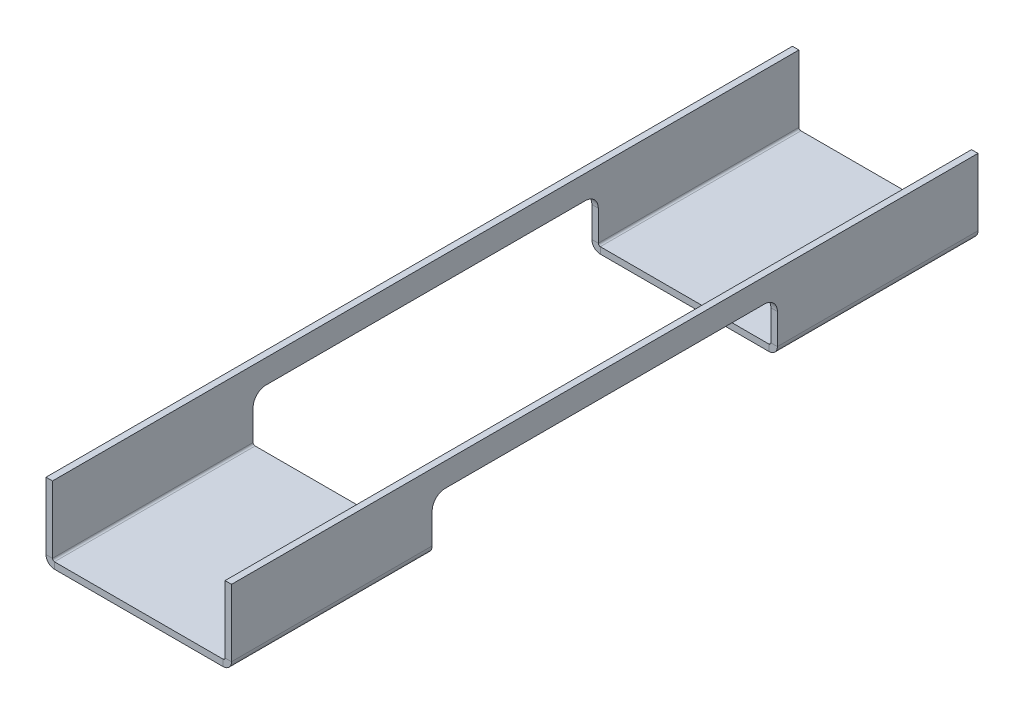
ISO-10303-21;
HEADER;
FILE_DESCRIPTION(('STEP AP214'),'2;1');
FILE_NAME('part.step','',(''),(''),'','','');
FILE_SCHEMA(('AUTOMOTIVE_DESIGN { 1 0 10303 214 1 1 1 1 }'));
ENDSEC;
DATA;
#1=APPLICATION_CONTEXT('core data for automotive mechanical design processes');
#2=APPLICATION_PROTOCOL_DEFINITION('international standard','automotive_design',2000,#1);
#3=PRODUCT_CONTEXT('',#1,'mechanical');
#4=PRODUCT('Part','Part','',(#3));
#5=PRODUCT_RELATED_PRODUCT_CATEGORY('part','',(#4));
#6=PRODUCT_DEFINITION_FORMATION('','',#4);
#7=PRODUCT_DEFINITION_CONTEXT('part definition',#1,'design');
#8=PRODUCT_DEFINITION('design','',#6,#7);
#9=PRODUCT_DEFINITION_SHAPE('','',#8);
#10=(LENGTH_UNIT() NAMED_UNIT(*) SI_UNIT(.MILLI.,.METRE.));
#11=(NAMED_UNIT(*) PLANE_ANGLE_UNIT() SI_UNIT($,.RADIAN.));
#12=(NAMED_UNIT(*) SI_UNIT($,.STERADIAN.) SOLID_ANGLE_UNIT());
#13=UNCERTAINTY_MEASURE_WITH_UNIT(LENGTH_MEASURE(1.E-05),#10,'distance_accuracy_value','');
#14=(GEOMETRIC_REPRESENTATION_CONTEXT(3) GLOBAL_UNCERTAINTY_ASSIGNED_CONTEXT((#13)) GLOBAL_UNIT_ASSIGNED_CONTEXT((#10,
#11,#12)) REPRESENTATION_CONTEXT('',''));
#15=CARTESIAN_POINT('',(0.,0.,0.));
#16=DIRECTION('',(0.,0.,1.));
#17=DIRECTION('',(1.,0.,0.));
#18=AXIS2_PLACEMENT_3D('',#15,#16,#17);
#19=CARTESIAN_POINT('',(-13.97,16.66875,200.81875));
#20=DIRECTION('',(0.,0.,1.));
#21=DIRECTION('',(1.,0.,0.));
#22=AXIS2_PLACEMENT_3D('',#19,#20,#21);
#23=PLANE('',#22);
#24=DIRECTION('',(0.,-1.,0.));
#25=VECTOR('',#24,1.);
#26=CARTESIAN_POINT('',(63.5,0.,200.81875));
#27=LINE('',#26,#25);
#28=CARTESIAN_POINT('',(63.5,11.90625,200.81875));
#29=VERTEX_POINT('',#28);
#30=CARTESIAN_POINT('',(63.5,0.7366,200.81875));
#31=VERTEX_POINT('',#30);
#32=EDGE_CURVE('E563',#29,#31,#27,.T.);
#33=ORIENTED_EDGE('',*,*,#32,.F.);
#34=DIRECTION('',(-1.,0.,0.));
#35=VECTOR('',#34,1.);
#36=CARTESIAN_POINT('',(65.88125,11.90625,200.81875));
#37=LINE('',#36,#35);
#38=CARTESIAN_POINT('',(65.88125,11.90625,200.81875));
#39=VERTEX_POINT('',#38);
#40=EDGE_CURVE('E326',#29,#39,#37,.F.);
#41=ORIENTED_EDGE('',*,*,#40,.T.);
#42=DIRECTION('',(0.,-1.,0.));
#43=VECTOR('',#42,1.);
#44=CARTESIAN_POINT('',(65.88125,0.,200.81875));
#45=LINE('',#44,#43);
#46=CARTESIAN_POINT('',(65.88125,0.7366,200.81875));
#47=VERTEX_POINT('',#46);
#48=EDGE_CURVE('E245',#39,#47,#45,.T.);
#49=ORIENTED_EDGE('',*,*,#48,.T.);
#50=DIRECTION('',(-1.,0.,0.));
#51=VECTOR('',#50,1.);
#52=CARTESIAN_POINT('',(65.88125,0.7366,200.81875));
#53=LINE('',#52,#51);
#54=EDGE_CURVE('E232',#47,#31,#53,.T.);
#55=ORIENTED_EDGE('',*,*,#54,.T.);
#56=EDGE_LOOP('',(#33,#41,#49,#55));
#57=FACE_BOUND('',#56,.T.);
#58=ADVANCED_FACE('F36',(#57),#23,.F.);
#59=DIRECTION('',(-1.,0.,0.));
#60=VECTOR('',#59,1.);
#61=CARTESIAN_POINT('',(0.,0.,200.81875));
#62=LINE('',#61,#60);
#63=CARTESIAN_POINT('',(62.7634,0.,200.81875));
#64=VERTEX_POINT('',#63);
#65=CARTESIAN_POINT('',(0.7366,0.,200.81875));
#66=VERTEX_POINT('',#65);
#67=EDGE_CURVE('E228',#64,#66,#62,.T.);
#68=ORIENTED_EDGE('',*,*,#67,.F.);
#69=DIRECTION('',(0.,-1.,0.));
#70=VECTOR('',#69,1.);
#71=CARTESIAN_POINT('',(62.7634,0.,200.81875));
#72=LINE('',#71,#70);
#73=CARTESIAN_POINT('',(62.7634,-2.38125,200.81875));
#74=VERTEX_POINT('',#73);
#75=EDGE_CURVE('E221',#64,#74,#72,.T.);
#76=ORIENTED_EDGE('',*,*,#75,.T.);
#77=DIRECTION('',(-1.,0.,0.));
#78=VECTOR('',#77,1.);
#79=CARTESIAN_POINT('',(-13.97,-2.38125,200.81875));
#80=LINE('',#79,#78);
#81=CARTESIAN_POINT('',(0.736599999999999,-2.38125,200.81875));
#82=VERTEX_POINT('',#81);
#83=EDGE_CURVE('E225',#74,#82,#80,.T.);
#84=ORIENTED_EDGE('',*,*,#83,.T.);
#85=DIRECTION('',(0.,1.,0.));
#86=VECTOR('',#85,1.);
#87=CARTESIAN_POINT('',(0.736599999999999,-2.38125,200.81875));
#88=LINE('',#87,#86);
#89=EDGE_CURVE('E233',#82,#66,#88,.T.);
#90=ORIENTED_EDGE('',*,*,#89,.T.);
#91=EDGE_LOOP('',(#68,#76,#84,#90));
#92=FACE_BOUND('',#91,.T.);
#93=ADVANCED_FACE('F223',(#92),#23,.F.);
#94=ORIENTED_EDGE('',*,*,#54,.F.);
#95=CARTESIAN_POINT('',(62.7634,0.7366,200.81875));
#96=DIRECTION('',(0.,0.,1.));
#97=DIRECTION('',(1.,0.,0.));
#98=AXIS2_PLACEMENT_3D('',#95,#96,#97);
#99=CIRCLE('',#98,3.11785);
#100=EDGE_CURVE('E237',#47,#74,#99,.F.);
#101=ORIENTED_EDGE('',*,*,#100,.T.);
#102=ORIENTED_EDGE('',*,*,#75,.F.);
#103=CARTESIAN_POINT('',(62.7634,0.7366,200.81875));
#104=DIRECTION('',(0.,0.,1.));
#105=DIRECTION('',(1.,0.,0.));
#106=AXIS2_PLACEMENT_3D('',#103,#104,#105);
#107=CIRCLE('',#106,0.7366);
#108=EDGE_CURVE('E566',#31,#64,#107,.F.);
#109=ORIENTED_EDGE('',*,*,#108,.F.);
#110=EDGE_LOOP('',(#94,#101,#102,#109));
#111=FACE_BOUND('',#110,.T.);
#112=ADVANCED_FACE('F238',(#111),#23,.F.);
#113=DIRECTION('',(0.,1.,0.));
#114=VECTOR('',#113,1.);
#115=CARTESIAN_POINT('',(-2.38125,0.,200.81875));
#116=LINE('',#115,#114);
#117=CARTESIAN_POINT('',(-2.38125,0.7366,200.81875));
#118=VERTEX_POINT('',#117);
#119=CARTESIAN_POINT('',(-2.38125,11.90625,200.81875));
#120=VERTEX_POINT('',#119);
#121=EDGE_CURVE('E514',#118,#120,#116,.T.);
#122=ORIENTED_EDGE('',*,*,#121,.T.);
#123=DIRECTION('',(-1.,0.,0.));
#124=VECTOR('',#123,1.);
#125=CARTESIAN_POINT('',(0.,11.90625,200.81875));
#126=LINE('',#125,#124);
#127=CARTESIAN_POINT('',(0.,11.90625,200.81875));
#128=VERTEX_POINT('',#127);
#129=EDGE_CURVE('E57',#120,#128,#126,.F.);
#130=ORIENTED_EDGE('',*,*,#129,.T.);
#131=DIRECTION('',(0.,1.,0.));
#132=VECTOR('',#131,1.);
#133=CARTESIAN_POINT('',(0.,0.,200.81875));
#134=LINE('',#133,#132);
#135=CARTESIAN_POINT('',(0.,0.7366,200.81875));
#136=VERTEX_POINT('',#135);
#137=EDGE_CURVE('E618',#136,#128,#134,.T.);
#138=ORIENTED_EDGE('',*,*,#137,.F.);
#139=DIRECTION('',(-1.,0.,0.));
#140=VECTOR('',#139,1.);
#141=CARTESIAN_POINT('',(0.,0.7366,200.81875));
#142=LINE('',#141,#140);
#143=EDGE_CURVE('E316',#136,#118,#142,.T.);
#144=ORIENTED_EDGE('',*,*,#143,.T.);
#145=EDGE_LOOP('',(#122,#130,#138,#144));
#146=FACE_BOUND('',#145,.T.);
#147=ADVANCED_FACE('F596',(#146),#23,.F.);
#148=CARTESIAN_POINT('',(-13.97,16.66875,73.81875));
#149=DIRECTION('',(0.,0.,-1.));
#150=DIRECTION('',(-1.,0.,0.));
#151=AXIS2_PLACEMENT_3D('',#148,#149,#150);
#152=PLANE('',#151);
#153=DIRECTION('',(0.,1.,0.));
#154=VECTOR('',#153,1.);
#155=CARTESIAN_POINT('',(65.88125,0.,73.81875));
#156=LINE('',#155,#154);
#157=CARTESIAN_POINT('',(65.88125,0.7366,73.81875));
#158=VERTEX_POINT('',#157);
#159=CARTESIAN_POINT('',(65.88125,11.90625,73.81875));
#160=VERTEX_POINT('',#159);
#161=EDGE_CURVE('E377',#158,#160,#156,.T.);
#162=ORIENTED_EDGE('',*,*,#161,.T.);
#163=DIRECTION('',(1.,0.,0.));
#164=VECTOR('',#163,1.);
#165=CARTESIAN_POINT('',(63.5,11.90625,73.81875));
#166=LINE('',#165,#164);
#167=CARTESIAN_POINT('',(63.5,11.90625,73.81875));
#168=VERTEX_POINT('',#167);
#169=EDGE_CURVE('E328',#160,#168,#166,.F.);
#170=ORIENTED_EDGE('',*,*,#169,.T.);
#171=DIRECTION('',(0.,1.,0.));
#172=VECTOR('',#171,1.);
#173=CARTESIAN_POINT('',(63.5,0.,73.81875));
#174=LINE('',#173,#172);
#175=CARTESIAN_POINT('',(63.5,0.7366,73.81875));
#176=VERTEX_POINT('',#175);
#177=EDGE_CURVE('E378',#176,#168,#174,.T.);
#178=ORIENTED_EDGE('',*,*,#177,.F.);
#179=DIRECTION('',(1.,0.,0.));
#180=VECTOR('',#179,1.);
#181=CARTESIAN_POINT('',(63.5,0.7366,73.81875));
#182=LINE('',#181,#180);
#183=EDGE_CURVE('E314',#176,#158,#182,.T.);
#184=ORIENTED_EDGE('',*,*,#183,.T.);
#185=EDGE_LOOP('',(#162,#170,#178,#184));
#186=FACE_BOUND('',#185,.T.);
#187=ADVANCED_FACE('F606',(#186),#152,.F.);
#188=DIRECTION('',(1.,0.,0.));
#189=VECTOR('',#188,1.);
#190=CARTESIAN_POINT('',(-13.97,-2.38125,73.81875));
#191=LINE('',#190,#189);
#192=CARTESIAN_POINT('',(0.736599999999999,-2.38125,73.81875));
#193=VERTEX_POINT('',#192);
#194=CARTESIAN_POINT('',(62.7634,-2.38125,73.81875));
#195=VERTEX_POINT('',#194);
#196=EDGE_CURVE('E256',#193,#195,#191,.T.);
#197=ORIENTED_EDGE('',*,*,#196,.T.);
#198=DIRECTION('',(0.,1.,0.));
#199=VECTOR('',#198,1.);
#200=CARTESIAN_POINT('',(62.7634,-2.38125,73.81875));
#201=LINE('',#200,#199);
#202=CARTESIAN_POINT('',(62.7634,0.,73.81875));
#203=VERTEX_POINT('',#202);
#204=EDGE_CURVE('E312',#195,#203,#201,.T.);
#205=ORIENTED_EDGE('',*,*,#204,.T.);
#206=DIRECTION('',(1.,0.,0.));
#207=VECTOR('',#206,1.);
#208=CARTESIAN_POINT('',(0.,0.,73.81875));
#209=LINE('',#208,#207);
#210=CARTESIAN_POINT('',(0.7366,0.,73.81875));
#211=VERTEX_POINT('',#210);
#212=EDGE_CURVE('E614',#211,#203,#209,.T.);
#213=ORIENTED_EDGE('',*,*,#212,.F.);
#214=DIRECTION('',(0.,-1.,0.));
#215=VECTOR('',#214,1.);
#216=CARTESIAN_POINT('',(0.7366,0.,73.81875));
#217=LINE('',#216,#215);
#218=EDGE_CURVE('E310',#211,#193,#217,.T.);
#219=ORIENTED_EDGE('',*,*,#218,.T.);
#220=EDGE_LOOP('',(#197,#205,#213,#219));
#221=FACE_BOUND('',#220,.T.);
#222=ADVANCED_FACE('F612',(#221),#152,.F.);
#223=ORIENTED_EDGE('',*,*,#183,.F.);
#224=CARTESIAN_POINT('',(62.7634,0.7366,73.81875));
#225=DIRECTION('',(0.,0.,-1.));
#226=DIRECTION('',(-1.,0.,0.));
#227=AXIS2_PLACEMENT_3D('',#224,#225,#226);
#228=CIRCLE('',#227,0.7366);
#229=EDGE_CURVE('E384',#203,#176,#228,.F.);
#230=ORIENTED_EDGE('',*,*,#229,.F.);
#231=ORIENTED_EDGE('',*,*,#204,.F.);
#232=CARTESIAN_POINT('',(62.7634,0.7366,73.81875));
#233=DIRECTION('',(0.,0.,-1.));
#234=DIRECTION('',(-1.,0.,0.));
#235=AXIS2_PLACEMENT_3D('',#232,#233,#234);
#236=CIRCLE('',#235,3.11785);
#237=EDGE_CURVE('E381',#195,#158,#236,.F.);
#238=ORIENTED_EDGE('',*,*,#237,.T.);
#239=EDGE_LOOP('',(#223,#230,#231,#238));
#240=FACE_BOUND('',#239,.T.);
#241=ADVANCED_FACE('F642',(#240),#152,.F.);
#242=DIRECTION('',(0.,-1.,0.));
#243=VECTOR('',#242,1.);
#244=CARTESIAN_POINT('',(0.,0.,73.81875));
#245=LINE('',#244,#243);
#246=CARTESIAN_POINT('',(0.,11.90625,73.81875));
#247=VERTEX_POINT('',#246);
#248=CARTESIAN_POINT('',(0.,0.7366,73.81875));
#249=VERTEX_POINT('',#248);
#250=EDGE_CURVE('E372',#247,#249,#245,.T.);
#251=ORIENTED_EDGE('',*,*,#250,.F.);
#252=DIRECTION('',(1.,0.,0.));
#253=VECTOR('',#252,1.);
#254=CARTESIAN_POINT('',(-2.38125,11.90625,73.81875));
#255=LINE('',#254,#253);
#256=CARTESIAN_POINT('',(-2.38125,11.90625,73.81875));
#257=VERTEX_POINT('',#256);
#258=EDGE_CURVE('E336',#247,#257,#255,.F.);
#259=ORIENTED_EDGE('',*,*,#258,.T.);
#260=DIRECTION('',(0.,-1.,0.));
#261=VECTOR('',#260,1.);
#262=CARTESIAN_POINT('',(-2.38125,0.,73.81875));
#263=LINE('',#262,#261);
#264=CARTESIAN_POINT('',(-2.38125,0.7366,73.81875));
#265=VERTEX_POINT('',#264);
#266=EDGE_CURVE('E356',#257,#265,#263,.T.);
#267=ORIENTED_EDGE('',*,*,#266,.T.);
#268=DIRECTION('',(1.,0.,0.));
#269=VECTOR('',#268,1.);
#270=CARTESIAN_POINT('',(-2.38125,0.7366,73.81875));
#271=LINE('',#270,#269);
#272=EDGE_CURVE('E307',#265,#249,#271,.T.);
#273=ORIENTED_EDGE('',*,*,#272,.T.);
#274=EDGE_LOOP('',(#251,#259,#267,#273));
#275=FACE_BOUND('',#274,.T.);
#276=ADVANCED_FACE('F374',(#275),#152,.F.);
#277=CARTESIAN_POINT('',(0.7366,0.7366,274.6375));
#278=DIRECTION('',(0.,0.,-1.));
#279=DIRECTION('',(-1.,0.,0.));
#280=AXIS2_PLACEMENT_3D('',#277,#278,#279);
#281=CYLINDRICAL_SURFACE('',#280,3.11785);
#282=CARTESIAN_POINT('',(0.7366,0.7366,73.81875));
#283=DIRECTION('',(0.,0.,-1.));
#284=DIRECTION('',(-1.,0.,0.));
#285=AXIS2_PLACEMENT_3D('',#282,#283,#284);
#286=CIRCLE('',#285,3.11785);
#287=EDGE_CURVE('E390',#265,#193,#286,.F.);
#288=ORIENTED_EDGE('',*,*,#287,.F.);
#289=DIRECTION('',(0.,0.,-1.));
#290=VECTOR('',#289,1.);
#291=CARTESIAN_POINT('',(-2.38125,0.7366,274.6375));
#292=LINE('',#291,#290);
#293=CARTESIAN_POINT('',(-2.38125,0.7366,0.));
#294=VERTEX_POINT('',#293);
#295=EDGE_CURVE('E270',#265,#294,#292,.T.);
#296=ORIENTED_EDGE('',*,*,#295,.T.);
#297=CARTESIAN_POINT('',(0.7366,0.7366,0.));
#298=DIRECTION('',(0.,0.,1.));
#299=DIRECTION('',(1.,0.,0.));
#300=AXIS2_PLACEMENT_3D('',#297,#298,#299);
#301=CIRCLE('',#300,3.11785);
#302=CARTESIAN_POINT('',(0.736599999999999,-2.38125,0.));
#303=VERTEX_POINT('',#302);
#304=EDGE_CURVE('E440',#303,#294,#301,.F.);
#305=ORIENTED_EDGE('',*,*,#304,.F.);
#306=DIRECTION('',(0.,0.,-1.));
#307=VECTOR('',#306,1.);
#308=CARTESIAN_POINT('',(0.736599999999999,-2.38125,274.6375));
#309=LINE('',#308,#307);
#310=EDGE_CURVE('E262',#193,#303,#309,.T.);
#311=ORIENTED_EDGE('',*,*,#310,.F.);
#312=EDGE_LOOP('',(#288,#296,#305,#311));
#313=FACE_BOUND('',#312,.T.);
#314=ADVANCED_FACE('F533',(#313),#281,.T.);
#315=CARTESIAN_POINT('',(0.,-2.38125,274.6375));
#316=DIRECTION('',(0.,-1.,0.));
#317=DIRECTION('',(0.,0.,-1.));
#318=AXIS2_PLACEMENT_3D('',#315,#316,#317);
#319=PLANE('',#318);
#320=ORIENTED_EDGE('',*,*,#196,.F.);
#321=ORIENTED_EDGE('',*,*,#310,.T.);
#322=DIRECTION('',(1.,0.,0.));
#323=VECTOR('',#322,1.);
#324=CARTESIAN_POINT('',(0.,-2.38125,0.));
#325=LINE('',#324,#323);
#326=CARTESIAN_POINT('',(62.7634,-2.38125,0.));
#327=VERTEX_POINT('',#326);
#328=EDGE_CURVE('E443',#327,#303,#325,.F.);
#329=ORIENTED_EDGE('',*,*,#328,.F.);
#330=DIRECTION('',(0.,0.,-1.));
#331=VECTOR('',#330,1.);
#332=CARTESIAN_POINT('',(62.7634,-2.38125,274.6375));
#333=LINE('',#332,#331);
#334=EDGE_CURVE('E263',#195,#327,#333,.T.);
#335=ORIENTED_EDGE('',*,*,#334,.F.);
#336=EDGE_LOOP('',(#320,#321,#329,#335));
#337=FACE_BOUND('',#336,.T.);
#338=ADVANCED_FACE('F542',(#337),#319,.T.);
#339=CARTESIAN_POINT('',(62.7634,0.7366,274.6375));
#340=DIRECTION('',(0.,0.,-1.));
#341=DIRECTION('',(-1.,0.,0.));
#342=AXIS2_PLACEMENT_3D('',#339,#340,#341);
#343=CYLINDRICAL_SURFACE('',#342,3.11785);
#344=ORIENTED_EDGE('',*,*,#237,.F.);
#345=ORIENTED_EDGE('',*,*,#334,.T.);
#346=CARTESIAN_POINT('',(62.7634,0.7366,0.));
#347=DIRECTION('',(0.,0.,1.));
#348=DIRECTION('',(1.,0.,0.));
#349=AXIS2_PLACEMENT_3D('',#346,#347,#348);
#350=CIRCLE('',#349,3.11785);
#351=CARTESIAN_POINT('',(65.88125,0.7366,0.));
#352=VERTEX_POINT('',#351);
#353=EDGE_CURVE('E446',#352,#327,#350,.F.);
#354=ORIENTED_EDGE('',*,*,#353,.F.);
#355=DIRECTION('',(0.,0.,-1.));
#356=VECTOR('',#355,1.);
#357=CARTESIAN_POINT('',(65.88125,0.7366,274.6375));
#358=LINE('',#357,#356);
#359=EDGE_CURVE('E483',#158,#352,#358,.T.);
#360=ORIENTED_EDGE('',*,*,#359,.F.);
#361=EDGE_LOOP('',(#344,#345,#354,#360));
#362=FACE_BOUND('',#361,.T.);
#363=ADVANCED_FACE('F549',(#362),#343,.T.);
#364=CARTESIAN_POINT('',(62.7634,0.7366,274.6375));
#365=DIRECTION('',(0.,0.,-1.));
#366=DIRECTION('',(-1.,0.,0.));
#367=AXIS2_PLACEMENT_3D('',#364,#365,#366);
#368=CYLINDRICAL_SURFACE('',#367,0.7366);
#369=DIRECTION('',(0.,0.,-1.));
#370=VECTOR('',#369,1.);
#371=CARTESIAN_POINT('',(62.7634,0.,274.6375));
#372=LINE('',#371,#370);
#373=CARTESIAN_POINT('',(62.7634,0.,0.));
#374=VERTEX_POINT('',#373);
#375=EDGE_CURVE('E473',#203,#374,#372,.T.);
#376=ORIENTED_EDGE('',*,*,#375,.F.);
#377=ORIENTED_EDGE('',*,*,#229,.T.);
#378=DIRECTION('',(0.,0.,-1.));
#379=VECTOR('',#378,1.);
#380=CARTESIAN_POINT('',(63.5,0.7366,274.6375));
#381=LINE('',#380,#379);
#382=CARTESIAN_POINT('',(63.5,0.7366,0.));
#383=VERTEX_POINT('',#382);
#384=EDGE_CURVE('E477',#176,#383,#381,.T.);
#385=ORIENTED_EDGE('',*,*,#384,.T.);
#386=CARTESIAN_POINT('',(62.7634,0.7366,0.));
#387=DIRECTION('',(0.,0.,1.));
#388=DIRECTION('',(1.,0.,0.));
#389=AXIS2_PLACEMENT_3D('',#386,#387,#388);
#390=CIRCLE('',#389,0.7366);
#391=EDGE_CURVE('E458',#383,#374,#390,.F.);
#392=ORIENTED_EDGE('',*,*,#391,.T.);
#393=EDGE_LOOP('',(#376,#377,#385,#392));
#394=FACE_BOUND('',#393,.T.);
#395=ADVANCED_FACE('F630',(#394),#368,.F.);
#396=CARTESIAN_POINT('',(0.,0.,274.6375));
#397=DIRECTION('',(0.,-1.,0.));
#398=DIRECTION('',(0.,0.,-1.));
#399=AXIS2_PLACEMENT_3D('',#396,#397,#398);
#400=PLANE('',#399);
#401=DIRECTION('',(0.,0.,-1.));
#402=VECTOR('',#401,1.);
#403=CARTESIAN_POINT('',(0.7366,0.,274.6375));
#404=LINE('',#403,#402);
#405=CARTESIAN_POINT('',(0.7366,0.,0.));
#406=VERTEX_POINT('',#405);
#407=EDGE_CURVE('E469',#211,#406,#404,.T.);
#408=ORIENTED_EDGE('',*,*,#407,.F.);
#409=ORIENTED_EDGE('',*,*,#212,.T.);
#410=ORIENTED_EDGE('',*,*,#375,.T.);
#411=DIRECTION('',(-1.,0.,0.));
#412=VECTOR('',#411,1.);
#413=CARTESIAN_POINT('',(0.,0.,0.));
#414=LINE('',#413,#412);
#415=EDGE_CURVE('E461',#374,#406,#414,.T.);
#416=ORIENTED_EDGE('',*,*,#415,.T.);
#417=EDGE_LOOP('',(#408,#409,#410,#416));
#418=FACE_BOUND('',#417,.T.);
#419=ADVANCED_FACE('F636',(#418),#400,.F.);
#420=CARTESIAN_POINT('',(0.7366,0.7366,274.6375));
#421=DIRECTION('',(0.,0.,-1.));
#422=DIRECTION('',(-1.,0.,0.));
#423=AXIS2_PLACEMENT_3D('',#420,#421,#422);
#424=CYLINDRICAL_SURFACE('',#423,0.7366);
#425=DIRECTION('',(0.,0.,-1.));
#426=VECTOR('',#425,1.);
#427=CARTESIAN_POINT('',(0.,0.7366,274.6375));
#428=LINE('',#427,#426);
#429=CARTESIAN_POINT('',(0.,0.7366,0.));
#430=VERTEX_POINT('',#429);
#431=EDGE_CURVE('E431',#249,#430,#428,.T.);
#432=ORIENTED_EDGE('',*,*,#431,.F.);
#433=CARTESIAN_POINT('',(0.7366,0.7366,73.81875));
#434=DIRECTION('',(0.,0.,-1.));
#435=DIRECTION('',(-1.,0.,0.));
#436=AXIS2_PLACEMENT_3D('',#433,#434,#435);
#437=CIRCLE('',#436,0.7366);
#438=EDGE_CURVE('E301',#249,#211,#437,.F.);
#439=ORIENTED_EDGE('',*,*,#438,.T.);
#440=ORIENTED_EDGE('',*,*,#407,.T.);
#441=CARTESIAN_POINT('',(0.7366,0.7366,0.));
#442=DIRECTION('',(0.,0.,1.));
#443=DIRECTION('',(1.,0.,0.));
#444=AXIS2_PLACEMENT_3D('',#441,#442,#443);
#445=CIRCLE('',#444,0.7366);
#446=EDGE_CURVE('E401',#406,#430,#445,.F.);
#447=ORIENTED_EDGE('',*,*,#446,.T.);
#448=EDGE_LOOP('',(#432,#439,#440,#447));
#449=FACE_BOUND('',#448,.T.);
#450=ADVANCED_FACE('F638',(#449),#424,.F.);
#451=CARTESIAN_POINT('',(63.5,0.7366,274.6375));
#452=DIRECTION('',(0.,0.,1.));
#453=DIRECTION('',(1.,0.,0.));
#454=AXIS2_PLACEMENT_3D('',#451,#452,#453);
#455=PLANE('',#454);
#456=DIRECTION('',(1.,0.,0.));
#457=VECTOR('',#456,1.);
#458=CARTESIAN_POINT('',(63.5,0.7366,274.6375));
#459=LINE('',#458,#457);
#460=CARTESIAN_POINT('',(63.5,0.7366,274.6375));
#461=VERTEX_POINT('',#460);
#462=CARTESIAN_POINT('',(65.88125,0.7366,274.6375));
#463=VERTEX_POINT('',#462);
#464=EDGE_CURVE('E296',#461,#463,#459,.T.);
#465=ORIENTED_EDGE('',*,*,#464,.F.);
#466=CARTESIAN_POINT('',(62.7634,0.7366,274.6375));
#467=DIRECTION('',(0.,0.,1.));
#468=DIRECTION('',(1.,0.,0.));
#469=AXIS2_PLACEMENT_3D('',#466,#467,#468);
#470=CIRCLE('',#469,0.7366);
#471=CARTESIAN_POINT('',(62.7634,0.,274.6375));
#472=VERTEX_POINT('',#471);
#473=EDGE_CURVE('E422',#461,#472,#470,.F.);
#474=ORIENTED_EDGE('',*,*,#473,.T.);
#475=DIRECTION('',(0.,1.,0.));
#476=VECTOR('',#475,1.);
#477=CARTESIAN_POINT('',(62.7634,-2.38125,274.6375));
#478=LINE('',#477,#476);
#479=CARTESIAN_POINT('',(62.7634,-2.38125,274.6375));
#480=VERTEX_POINT('',#479);
#481=EDGE_CURVE('E294',#480,#472,#478,.T.);
#482=ORIENTED_EDGE('',*,*,#481,.F.);
#483=CARTESIAN_POINT('',(62.7634,0.7366,274.6375));
#484=DIRECTION('',(0.,0.,1.));
#485=DIRECTION('',(1.,0.,0.));
#486=AXIS2_PLACEMENT_3D('',#483,#484,#485);
#487=CIRCLE('',#486,3.11785);
#488=EDGE_CURVE('E261',#463,#480,#487,.F.);
#489=ORIENTED_EDGE('',*,*,#488,.F.);
#490=EDGE_LOOP('',(#465,#474,#482,#489));
#491=FACE_BOUND('',#490,.T.);
#492=ADVANCED_FACE('F496',(#491),#455,.T.);
#493=CARTESIAN_POINT('',(62.7634,-2.38125,274.6375));
#494=DIRECTION('',(0.,0.,1.));
#495=DIRECTION('',(1.,0.,0.));
#496=AXIS2_PLACEMENT_3D('',#493,#494,#495);
#497=PLANE('',#496);
#498=DIRECTION('',(0.,-1.,0.));
#499=VECTOR('',#498,1.);
#500=CARTESIAN_POINT('',(63.5,0.,274.6375));
#501=LINE('',#500,#499);
#502=CARTESIAN_POINT('',(63.5,25.4,274.6375));
#503=VERTEX_POINT('',#502);
#504=EDGE_CURVE('E419',#503,#461,#501,.T.);
#505=ORIENTED_EDGE('',*,*,#504,.T.);
#506=ORIENTED_EDGE('',*,*,#464,.T.);
#507=DIRECTION('',(0.,1.,0.));
#508=VECTOR('',#507,1.);
#509=CARTESIAN_POINT('',(65.88125,0.,274.6375));
#510=LINE('',#509,#508);
#511=CARTESIAN_POINT('',(65.88125,25.4,274.6375));
#512=VERTEX_POINT('',#511);
#513=EDGE_CURVE('E413',#512,#463,#510,.F.);
#514=ORIENTED_EDGE('',*,*,#513,.F.);
#515=DIRECTION('',(1.,0.,0.));
#516=VECTOR('',#515,1.);
#517=CARTESIAN_POINT('',(63.5,25.4,274.6375));
#518=LINE('',#517,#516);
#519=EDGE_CURVE('E416',#503,#512,#518,.T.);
#520=ORIENTED_EDGE('',*,*,#519,.F.);
#521=EDGE_LOOP('',(#505,#506,#514,#520));
#522=FACE_BOUND('',#521,.T.);
#523=ADVANCED_FACE('F555',(#522),#497,.T.);
#524=CARTESIAN_POINT('',(62.7634,0.,0.));
#525=DIRECTION('',(0.,0.,-1.));
#526=DIRECTION('',(-1.,0.,0.));
#527=AXIS2_PLACEMENT_3D('',#524,#525,#526);
#528=PLANE('',#527);
#529=DIRECTION('',(0.,-1.,0.));
#530=VECTOR('',#529,1.);
#531=CARTESIAN_POINT('',(62.7634,0.,0.));
#532=LINE('',#531,#530);
#533=EDGE_CURVE('E291',#374,#327,#532,.T.);
#534=ORIENTED_EDGE('',*,*,#533,.F.);
#535=ORIENTED_EDGE('',*,*,#391,.F.);
#536=DIRECTION('',(-1.,0.,0.));
#537=VECTOR('',#536,1.);
#538=CARTESIAN_POINT('',(65.88125,0.7366,0.));
#539=LINE('',#538,#537);
#540=EDGE_CURVE('E288',#352,#383,#539,.T.);
#541=ORIENTED_EDGE('',*,*,#540,.F.);
#542=ORIENTED_EDGE('',*,*,#353,.T.);
#543=EDGE_LOOP('',(#534,#535,#541,#542));
#544=FACE_BOUND('',#543,.T.);
#545=ADVANCED_FACE('F545',(#544),#528,.T.);
#546=CARTESIAN_POINT('',(65.88125,0.7366,0.));
#547=DIRECTION('',(0.,0.,-1.));
#548=DIRECTION('',(-1.,0.,0.));
#549=AXIS2_PLACEMENT_3D('',#546,#547,#548);
#550=PLANE('',#549);
#551=ORIENTED_EDGE('',*,*,#415,.F.);
#552=ORIENTED_EDGE('',*,*,#533,.T.);
#553=ORIENTED_EDGE('',*,*,#328,.T.);
#554=DIRECTION('',(0.,1.,0.));
#555=VECTOR('',#554,1.);
#556=CARTESIAN_POINT('',(0.736599999999999,-2.38125,0.));
#557=LINE('',#556,#555);
#558=EDGE_CURVE('E278',#303,#406,#557,.T.);
#559=ORIENTED_EDGE('',*,*,#558,.T.);
#560=EDGE_LOOP('',(#551,#552,#553,#559));
#561=FACE_BOUND('',#560,.T.);
#562=ADVANCED_FACE('F537',(#561),#550,.T.);
#563=CARTESIAN_POINT('',(0.7366,0.,274.6375));
#564=DIRECTION('',(0.,0.,1.));
#565=DIRECTION('',(1.,0.,0.));
#566=AXIS2_PLACEMENT_3D('',#563,#564,#565);
#567=PLANE('',#566);
#568=DIRECTION('',(0.,-1.,0.));
#569=VECTOR('',#568,1.);
#570=CARTESIAN_POINT('',(0.7366,0.,274.6375));
#571=LINE('',#570,#569);
#572=CARTESIAN_POINT('',(0.7366,0.,274.6375));
#573=VERTEX_POINT('',#572);
#574=CARTESIAN_POINT('',(0.736599999999999,-2.38125,274.6375));
#575=VERTEX_POINT('',#574);
#576=EDGE_CURVE('E286',#573,#575,#571,.T.);
#577=ORIENTED_EDGE('',*,*,#576,.F.);
#578=CARTESIAN_POINT('',(0.7366,0.7366,274.6375));
#579=DIRECTION('',(0.,0.,1.));
#580=DIRECTION('',(1.,0.,0.));
#581=AXIS2_PLACEMENT_3D('',#578,#579,#580);
#582=CIRCLE('',#581,0.7366);
#583=CARTESIAN_POINT('',(0.,0.7366,274.6375));
#584=VERTEX_POINT('',#583);
#585=EDGE_CURVE('E428',#573,#584,#582,.F.);
#586=ORIENTED_EDGE('',*,*,#585,.T.);
#587=DIRECTION('',(1.,0.,0.));
#588=VECTOR('',#587,1.);
#589=CARTESIAN_POINT('',(-2.38125,0.7366,274.6375));
#590=LINE('',#589,#588);
#591=CARTESIAN_POINT('',(-2.38125,0.7366,274.6375));
#592=VERTEX_POINT('',#591);
#593=EDGE_CURVE('E284',#592,#584,#590,.T.);
#594=ORIENTED_EDGE('',*,*,#593,.F.);
#595=CARTESIAN_POINT('',(0.7366,0.7366,274.6375));
#596=DIRECTION('',(0.,0.,1.));
#597=DIRECTION('',(1.,0.,0.));
#598=AXIS2_PLACEMENT_3D('',#595,#596,#597);
#599=CIRCLE('',#598,3.11785);
#600=EDGE_CURVE('E407',#575,#592,#599,.F.);
#601=ORIENTED_EDGE('',*,*,#600,.F.);
#602=EDGE_LOOP('',(#577,#586,#594,#601));
#603=FACE_BOUND('',#602,.T.);
#604=ADVANCED_FACE('F508',(#603),#567,.T.);
#605=CARTESIAN_POINT('',(-2.38125,0.7366,274.6375));
#606=DIRECTION('',(0.,0.,1.));
#607=DIRECTION('',(1.,0.,0.));
#608=AXIS2_PLACEMENT_3D('',#605,#606,#607);
#609=PLANE('',#608);
#610=DIRECTION('',(-1.,0.,0.));
#611=VECTOR('',#610,1.);
#612=CARTESIAN_POINT('',(0.,0.,274.6375));
#613=LINE('',#612,#611);
#614=EDGE_CURVE('E425',#472,#573,#613,.T.);
#615=ORIENTED_EDGE('',*,*,#614,.T.);
#616=ORIENTED_EDGE('',*,*,#576,.T.);
#617=DIRECTION('',(1.,0.,0.));
#618=VECTOR('',#617,1.);
#619=CARTESIAN_POINT('',(0.,-2.38125,274.6375));
#620=LINE('',#619,#618);
#621=EDGE_CURVE('E410',#480,#575,#620,.F.);
#622=ORIENTED_EDGE('',*,*,#621,.F.);
#623=ORIENTED_EDGE('',*,*,#481,.T.);
#624=EDGE_LOOP('',(#615,#616,#622,#623));
#625=FACE_BOUND('',#624,.T.);
#626=ADVANCED_FACE('F500',(#625),#609,.T.);
#627=CARTESIAN_POINT('',(0.,0.7366,0.));
#628=DIRECTION('',(0.,0.,-1.));
#629=DIRECTION('',(-1.,0.,0.));
#630=AXIS2_PLACEMENT_3D('',#627,#628,#629);
#631=PLANE('',#630);
#632=DIRECTION('',(-1.,0.,0.));
#633=VECTOR('',#632,1.);
#634=CARTESIAN_POINT('',(0.,0.7366,0.));
#635=LINE('',#634,#633);
#636=EDGE_CURVE('E281',#430,#294,#635,.T.);
#637=ORIENTED_EDGE('',*,*,#636,.F.);
#638=ORIENTED_EDGE('',*,*,#446,.F.);
#639=ORIENTED_EDGE('',*,*,#558,.F.);
#640=ORIENTED_EDGE('',*,*,#304,.T.);
#641=EDGE_LOOP('',(#637,#638,#639,#640));
#642=FACE_BOUND('',#641,.T.);
#643=ADVANCED_FACE('F528',(#642),#631,.T.);
#644=CARTESIAN_POINT('',(0.736599999999999,-2.38125,0.));
#645=DIRECTION('',(0.,0.,-1.));
#646=DIRECTION('',(-1.,0.,0.));
#647=AXIS2_PLACEMENT_3D('',#644,#645,#646);
#648=PLANE('',#647);
#649=DIRECTION('',(0.,1.,0.));
#650=VECTOR('',#649,1.);
#651=CARTESIAN_POINT('',(0.,0.,0.));
#652=LINE('',#651,#650);
#653=CARTESIAN_POINT('',(0.,25.4,0.));
#654=VERTEX_POINT('',#653);
#655=EDGE_CURVE('E397',#430,#654,#652,.T.);
#656=ORIENTED_EDGE('',*,*,#655,.F.);
#657=ORIENTED_EDGE('',*,*,#636,.T.);
#658=DIRECTION('',(0.,1.,0.));
#659=VECTOR('',#658,1.);
#660=CARTESIAN_POINT('',(-2.38125,0.,0.));
#661=LINE('',#660,#659);
#662=CARTESIAN_POINT('',(-2.38125,25.4,0.));
#663=VERTEX_POINT('',#662);
#664=EDGE_CURVE('E437',#294,#663,#661,.T.);
#665=ORIENTED_EDGE('',*,*,#664,.T.);
#666=DIRECTION('',(1.,0.,0.));
#667=VECTOR('',#666,1.);
#668=CARTESIAN_POINT('',(-2.38125,25.4,0.));
#669=LINE('',#668,#667);
#670=EDGE_CURVE('E434',#663,#654,#669,.T.);
#671=ORIENTED_EDGE('',*,*,#670,.T.);
#672=EDGE_LOOP('',(#656,#657,#665,#671));
#673=FACE_BOUND('',#672,.T.);
#674=ADVANCED_FACE('F574',(#673),#648,.T.);
#675=CARTESIAN_POINT('',(0.,0.,274.6375));
#676=DIRECTION('',(-1.,0.,0.));
#677=DIRECTION('',(0.,0.,1.));
#678=AXIS2_PLACEMENT_3D('',#675,#676,#677);
#679=PLANE('',#678);
#680=ORIENTED_EDGE('',*,*,#137,.T.);
#681=CARTESIAN_POINT('',(0.,11.90625,196.05625));
#682=DIRECTION('',(-1.,0.,0.));
#683=DIRECTION('',(0.,0.,1.));
#684=AXIS2_PLACEMENT_3D('',#681,#682,#683);
#685=CIRCLE('',#684,4.7625);
#686=CARTESIAN_POINT('',(0.,16.66875,196.05625));
#687=VERTEX_POINT('',#686);
#688=EDGE_CURVE('E11',#128,#687,#685,.T.);
#689=ORIENTED_EDGE('',*,*,#688,.T.);
#690=DIRECTION('',(0.,0.,-1.));
#691=VECTOR('',#690,1.);
#692=CARTESIAN_POINT('',(0.,16.66875,274.6375));
#693=LINE('',#692,#691);
#694=CARTESIAN_POINT('',(0.,16.66875,78.58125));
#695=VERTEX_POINT('',#694);
#696=EDGE_CURVE('E365',#687,#695,#693,.T.);
#697=ORIENTED_EDGE('',*,*,#696,.T.);
#698=CARTESIAN_POINT('',(0.,11.90625,78.58125));
#699=DIRECTION('',(-1.,0.,0.));
#700=DIRECTION('',(0.,0.,1.));
#701=AXIS2_PLACEMENT_3D('',#698,#699,#700);
#702=CIRCLE('',#701,4.7625);
#703=EDGE_CURVE('E347',#695,#247,#702,.T.);
#704=ORIENTED_EDGE('',*,*,#703,.T.);
#705=ORIENTED_EDGE('',*,*,#250,.T.);
#706=ORIENTED_EDGE('',*,*,#431,.T.);
#707=ORIENTED_EDGE('',*,*,#655,.T.);
#708=DIRECTION('',(0.,0.,-1.));
#709=VECTOR('',#708,1.);
#710=CARTESIAN_POINT('',(0.,25.4,274.6375));
#711=LINE('',#710,#709);
#712=CARTESIAN_POINT('',(0.,25.4,274.6375));
#713=VERTEX_POINT('',#712);
#714=EDGE_CURVE('E276',#713,#654,#711,.T.);
#715=ORIENTED_EDGE('',*,*,#714,.F.);
#716=DIRECTION('',(0.,1.,0.));
#717=VECTOR('',#716,1.);
#718=CARTESIAN_POINT('',(0.,0.,274.6375));
#719=LINE('',#718,#717);
#720=EDGE_CURVE('E398',#584,#713,#719,.T.);
#721=ORIENTED_EDGE('',*,*,#720,.F.);
#722=EDGE_CURVE('E466',#584,#136,#428,.T.);
#723=ORIENTED_EDGE('',*,*,#722,.T.);
#724=EDGE_LOOP('',(#680,#689,#697,#704,#705,#706,#707,#715,#721,#723));
#725=FACE_BOUND('',#724,.T.);
#726=ADVANCED_FACE('F371',(#725),#679,.F.);
#727=CARTESIAN_POINT('',(-2.38125,25.4,274.6375));
#728=DIRECTION('',(0.,1.,0.));
#729=DIRECTION('',(-1.,0.,0.));
#730=AXIS2_PLACEMENT_3D('',#727,#728,#729);
#731=PLANE('',#730);
#732=ORIENTED_EDGE('',*,*,#670,.F.);
#733=DIRECTION('',(0.,0.,-1.));
#734=VECTOR('',#733,1.);
#735=CARTESIAN_POINT('',(-2.38125,25.4,274.6375));
#736=LINE('',#735,#734);
#737=CARTESIAN_POINT('',(-2.38125,25.4,274.6375));
#738=VERTEX_POINT('',#737);
#739=EDGE_CURVE('E274',#738,#663,#736,.T.);
#740=ORIENTED_EDGE('',*,*,#739,.F.);
#741=DIRECTION('',(1.,0.,0.));
#742=VECTOR('',#741,1.);
#743=CARTESIAN_POINT('',(-2.38125,25.4,274.6375));
#744=LINE('',#743,#742);
#745=EDGE_CURVE('E400',#738,#713,#744,.T.);
#746=ORIENTED_EDGE('',*,*,#745,.T.);
#747=ORIENTED_EDGE('',*,*,#714,.T.);
#748=EDGE_LOOP('',(#732,#740,#746,#747));
#749=FACE_BOUND('',#748,.T.);
#750=ADVANCED_FACE('F521',(#749),#731,.T.);
#751=CARTESIAN_POINT('',(-2.38125,0.,274.6375));
#752=DIRECTION('',(-1.,0.,0.));
#753=DIRECTION('',(0.,0.,1.));
#754=AXIS2_PLACEMENT_3D('',#751,#752,#753);
#755=PLANE('',#754);
#756=ORIENTED_EDGE('',*,*,#266,.F.);
#757=CARTESIAN_POINT('',(-2.38125,11.90625,78.58125));
#758=DIRECTION('',(-1.,0.,0.));
#759=DIRECTION('',(0.,0.,1.));
#760=AXIS2_PLACEMENT_3D('',#757,#758,#759);
#761=CIRCLE('',#760,4.7625);
#762=CARTESIAN_POINT('',(-2.38125,16.66875,78.58125));
#763=VERTEX_POINT('',#762);
#764=EDGE_CURVE('E349',#257,#763,#761,.F.);
#765=ORIENTED_EDGE('',*,*,#764,.T.);
#766=DIRECTION('',(0.,0.,-1.));
#767=VECTOR('',#766,1.);
#768=CARTESIAN_POINT('',(-2.38125,16.66875,274.6375));
#769=LINE('',#768,#767);
#770=CARTESIAN_POINT('',(-2.38125,16.66875,196.05625));
#771=VERTEX_POINT('',#770);
#772=EDGE_CURVE('E354',#771,#763,#769,.T.);
#773=ORIENTED_EDGE('',*,*,#772,.F.);
#774=CARTESIAN_POINT('',(-2.38125,11.90625,196.05625));
#775=DIRECTION('',(-1.,0.,0.));
#776=DIRECTION('',(0.,0.,1.));
#777=AXIS2_PLACEMENT_3D('',#774,#775,#776);
#778=CIRCLE('',#777,4.7625);
#779=EDGE_CURVE('E44',#771,#120,#778,.F.);
#780=ORIENTED_EDGE('',*,*,#779,.T.);
#781=ORIENTED_EDGE('',*,*,#121,.F.);
#782=EDGE_CURVE('E271',#592,#118,#292,.T.);
#783=ORIENTED_EDGE('',*,*,#782,.F.);
#784=DIRECTION('',(0.,1.,0.));
#785=VECTOR('',#784,1.);
#786=CARTESIAN_POINT('',(-2.38125,0.,274.6375));
#787=LINE('',#786,#785);
#788=EDGE_CURVE('E404',#592,#738,#787,.T.);
#789=ORIENTED_EDGE('',*,*,#788,.T.);
#790=ORIENTED_EDGE('',*,*,#739,.T.);
#791=ORIENTED_EDGE('',*,*,#664,.F.);
#792=ORIENTED_EDGE('',*,*,#295,.F.);
#793=EDGE_LOOP('',(#756,#765,#773,#780,#781,#783,#789,#790,#791,#792));
#794=FACE_BOUND('',#793,.T.);
#795=ADVANCED_FACE('F353',(#794),#755,.T.);
#796=CARTESIAN_POINT('',(0.7366,0.7366,200.81875));
#797=DIRECTION('',(0.,0.,1.));
#798=DIRECTION('',(1.,0.,0.));
#799=AXIS2_PLACEMENT_3D('',#796,#797,#798);
#800=CIRCLE('',#799,3.11785);
#801=EDGE_CURVE('E244',#82,#118,#800,.F.);
#802=ORIENTED_EDGE('',*,*,#801,.F.);
#803=EDGE_CURVE('E255',#575,#82,#309,.T.);
#804=ORIENTED_EDGE('',*,*,#803,.F.);
#805=ORIENTED_EDGE('',*,*,#600,.T.);
#806=ORIENTED_EDGE('',*,*,#782,.T.);
#807=EDGE_LOOP('',(#802,#804,#805,#806));
#808=FACE_BOUND('',#807,.T.);
#809=ADVANCED_FACE('F506',(#808),#281,.T.);
#810=ORIENTED_EDGE('',*,*,#83,.F.);
#811=EDGE_CURVE('E252',#480,#74,#333,.T.);
#812=ORIENTED_EDGE('',*,*,#811,.F.);
#813=ORIENTED_EDGE('',*,*,#621,.T.);
#814=ORIENTED_EDGE('',*,*,#803,.T.);
#815=EDGE_LOOP('',(#810,#812,#813,#814));
#816=FACE_BOUND('',#815,.T.);
#817=ADVANCED_FACE('F250',(#816),#319,.T.);
#818=ORIENTED_EDGE('',*,*,#100,.F.);
#819=EDGE_CURVE('E266',#463,#47,#358,.T.);
#820=ORIENTED_EDGE('',*,*,#819,.F.);
#821=ORIENTED_EDGE('',*,*,#488,.T.);
#822=ORIENTED_EDGE('',*,*,#811,.T.);
#823=EDGE_LOOP('',(#818,#820,#821,#822));
#824=FACE_BOUND('',#823,.T.);
#825=ADVANCED_FACE('F259',(#824),#343,.T.);
#826=CARTESIAN_POINT('',(65.88125,0.,274.6375));
#827=DIRECTION('',(1.,0.,0.));
#828=DIRECTION('',(0.,0.,-1.));
#829=AXIS2_PLACEMENT_3D('',#826,#827,#828);
#830=PLANE('',#829);
#831=ORIENTED_EDGE('',*,*,#161,.F.);
#832=ORIENTED_EDGE('',*,*,#359,.T.);
#833=DIRECTION('',(0.,1.,0.));
#834=VECTOR('',#833,1.);
#835=CARTESIAN_POINT('',(65.88125,0.,0.));
#836=LINE('',#835,#834);
#837=CARTESIAN_POINT('',(65.88125,25.4,0.));
#838=VERTEX_POINT('',#837);
#839=EDGE_CURVE('E449',#838,#352,#836,.F.);
#840=ORIENTED_EDGE('',*,*,#839,.F.);
#841=DIRECTION('',(0.,0.,-1.));
#842=VECTOR('',#841,1.);
#843=CARTESIAN_POINT('',(65.88125,25.4,274.6375));
#844=LINE('',#843,#842);
#845=EDGE_CURVE('E482',#512,#838,#844,.T.);
#846=ORIENTED_EDGE('',*,*,#845,.F.);
#847=ORIENTED_EDGE('',*,*,#513,.T.);
#848=ORIENTED_EDGE('',*,*,#819,.T.);
#849=ORIENTED_EDGE('',*,*,#48,.F.);
#850=CARTESIAN_POINT('',(65.88125,11.90625,196.05625));
#851=DIRECTION('',(1.,0.,0.));
#852=DIRECTION('',(0.,0.,-1.));
#853=AXIS2_PLACEMENT_3D('',#850,#851,#852);
#854=CIRCLE('',#853,4.7625);
#855=CARTESIAN_POINT('',(65.88125,16.66875,196.05625));
#856=VERTEX_POINT('',#855);
#857=EDGE_CURVE('E341',#39,#856,#854,.F.);
#858=ORIENTED_EDGE('',*,*,#857,.T.);
#859=DIRECTION('',(0.,0.,1.));
#860=VECTOR('',#859,1.);
#861=CARTESIAN_POINT('',(65.88125,16.66875,274.6375));
#862=LINE('',#861,#860);
#863=CARTESIAN_POINT('',(65.88125,16.66875,78.58125));
#864=VERTEX_POINT('',#863);
#865=EDGE_CURVE('E366',#864,#856,#862,.T.);
#866=ORIENTED_EDGE('',*,*,#865,.F.);
#867=CARTESIAN_POINT('',(65.88125,11.90625,78.58125));
#868=DIRECTION('',(1.,0.,0.));
#869=DIRECTION('',(0.,0.,-1.));
#870=AXIS2_PLACEMENT_3D('',#867,#868,#869);
#871=CIRCLE('',#870,4.7625);
#872=EDGE_CURVE('E343',#864,#160,#871,.F.);
#873=ORIENTED_EDGE('',*,*,#872,.T.);
#874=EDGE_LOOP('',(#831,#832,#840,#846,#847,#848,#849,#858,#866,#873));
#875=FACE_BOUND('',#874,.T.);
#876=ADVANCED_FACE('F492',(#875),#830,.T.);
#877=CARTESIAN_POINT('',(63.5,25.4,274.6375));
#878=DIRECTION('',(0.,1.,0.));
#879=DIRECTION('',(-1.,0.,0.));
#880=AXIS2_PLACEMENT_3D('',#877,#878,#879);
#881=PLANE('',#880);
#882=DIRECTION('',(1.,0.,0.));
#883=VECTOR('',#882,1.);
#884=CARTESIAN_POINT('',(63.5,25.4,0.));
#885=LINE('',#884,#883);
#886=CARTESIAN_POINT('',(63.5,25.4,0.));
#887=VERTEX_POINT('',#886);
#888=EDGE_CURVE('E452',#887,#838,#885,.T.);
#889=ORIENTED_EDGE('',*,*,#888,.F.);
#890=DIRECTION('',(0.,0.,-1.));
#891=VECTOR('',#890,1.);
#892=CARTESIAN_POINT('',(63.5,25.4,274.6375));
#893=LINE('',#892,#891);
#894=EDGE_CURVE('E481',#503,#887,#893,.T.);
#895=ORIENTED_EDGE('',*,*,#894,.F.);
#896=ORIENTED_EDGE('',*,*,#519,.T.);
#897=ORIENTED_EDGE('',*,*,#845,.T.);
#898=EDGE_LOOP('',(#889,#895,#896,#897));
#899=FACE_BOUND('',#898,.T.);
#900=ADVANCED_FACE('F556',(#899),#881,.T.);
#901=CARTESIAN_POINT('',(63.5,0.,274.6375));
#902=DIRECTION('',(1.,0.,0.));
#903=DIRECTION('',(0.,0.,-1.));
#904=AXIS2_PLACEMENT_3D('',#901,#902,#903);
#905=PLANE('',#904);
#906=ORIENTED_EDGE('',*,*,#384,.F.);
#907=ORIENTED_EDGE('',*,*,#177,.T.);
#908=CARTESIAN_POINT('',(63.5,11.90625,78.58125));
#909=DIRECTION('',(1.,0.,0.));
#910=DIRECTION('',(0.,0.,-1.));
#911=AXIS2_PLACEMENT_3D('',#908,#909,#910);
#912=CIRCLE('',#911,4.7625);
#913=CARTESIAN_POINT('',(63.5,16.66875,78.58125));
#914=VERTEX_POINT('',#913);
#915=EDGE_CURVE('E345',#168,#914,#912,.T.);
#916=ORIENTED_EDGE('',*,*,#915,.T.);
#917=DIRECTION('',(0.,0.,1.));
#918=VECTOR('',#917,1.);
#919=CARTESIAN_POINT('',(63.5,16.66875,274.6375));
#920=LINE('',#919,#918);
#921=CARTESIAN_POINT('',(63.5,16.66875,196.05625));
#922=VERTEX_POINT('',#921);
#923=EDGE_CURVE('E304',#914,#922,#920,.T.);
#924=ORIENTED_EDGE('',*,*,#923,.T.);
#925=CARTESIAN_POINT('',(63.5,11.90625,196.05625));
#926=DIRECTION('',(1.,0.,0.));
#927=DIRECTION('',(0.,0.,-1.));
#928=AXIS2_PLACEMENT_3D('',#925,#926,#927);
#929=CIRCLE('',#928,4.7625);
#930=EDGE_CURVE('E339',#922,#29,#929,.T.);
#931=ORIENTED_EDGE('',*,*,#930,.T.);
#932=ORIENTED_EDGE('',*,*,#32,.T.);
#933=EDGE_CURVE('E478',#461,#31,#381,.T.);
#934=ORIENTED_EDGE('',*,*,#933,.F.);
#935=ORIENTED_EDGE('',*,*,#504,.F.);
#936=ORIENTED_EDGE('',*,*,#894,.T.);
#937=DIRECTION('',(0.,-1.,0.));
#938=VECTOR('',#937,1.);
#939=CARTESIAN_POINT('',(63.5,0.,0.));
#940=LINE('',#939,#938);
#941=EDGE_CURVE('E455',#887,#383,#940,.T.);
#942=ORIENTED_EDGE('',*,*,#941,.T.);
#943=EDGE_LOOP('',(#906,#907,#916,#924,#931,#932,#934,#935,#936,#942));
#944=FACE_BOUND('',#943,.T.);
#945=ADVANCED_FACE('F561',(#944),#905,.F.);
#946=ORIENTED_EDGE('',*,*,#933,.T.);
#947=ORIENTED_EDGE('',*,*,#108,.T.);
#948=EDGE_CURVE('E474',#472,#64,#372,.T.);
#949=ORIENTED_EDGE('',*,*,#948,.F.);
#950=ORIENTED_EDGE('',*,*,#473,.F.);
#951=EDGE_LOOP('',(#946,#947,#949,#950));
#952=FACE_BOUND('',#951,.T.);
#953=ADVANCED_FACE('F565',(#952),#368,.F.);
#954=ORIENTED_EDGE('',*,*,#948,.T.);
#955=ORIENTED_EDGE('',*,*,#67,.T.);
#956=EDGE_CURVE('E470',#573,#66,#404,.T.);
#957=ORIENTED_EDGE('',*,*,#956,.F.);
#958=ORIENTED_EDGE('',*,*,#614,.F.);
#959=EDGE_LOOP('',(#954,#955,#957,#958));
#960=FACE_BOUND('',#959,.T.);
#961=ADVANCED_FACE('F568',(#960),#400,.F.);
#962=ORIENTED_EDGE('',*,*,#956,.T.);
#963=CARTESIAN_POINT('',(0.7366,0.7366,200.81875));
#964=DIRECTION('',(0.,0.,1.));
#965=DIRECTION('',(1.,0.,0.));
#966=AXIS2_PLACEMENT_3D('',#963,#964,#965);
#967=CIRCLE('',#966,0.7366);
#968=EDGE_CURVE('E298',#66,#136,#967,.F.);
#969=ORIENTED_EDGE('',*,*,#968,.T.);
#970=ORIENTED_EDGE('',*,*,#722,.F.);
#971=ORIENTED_EDGE('',*,*,#585,.F.);
#972=EDGE_LOOP('',(#962,#969,#970,#971));
#973=FACE_BOUND('',#972,.T.);
#974=ADVANCED_FACE('F570',(#973),#424,.F.);
#975=CARTESIAN_POINT('',(0.7366,0.7366,274.6375));
#976=DIRECTION('',(0.,0.,1.));
#977=DIRECTION('',(1.,0.,0.));
#978=AXIS2_PLACEMENT_3D('',#975,#976,#977);
#979=PLANE('',#978);
#980=ORIENTED_EDGE('',*,*,#720,.T.);
#981=ORIENTED_EDGE('',*,*,#745,.F.);
#982=ORIENTED_EDGE('',*,*,#788,.F.);
#983=ORIENTED_EDGE('',*,*,#593,.T.);
#984=EDGE_LOOP('',(#980,#981,#982,#983));
#985=FACE_BOUND('',#984,.T.);
#986=ADVANCED_FACE('F516',(#985),#979,.T.);
#987=CARTESIAN_POINT('',(0.7366,0.7366,0.));
#988=DIRECTION('',(0.,0.,1.));
#989=DIRECTION('',(1.,0.,0.));
#990=AXIS2_PLACEMENT_3D('',#987,#988,#989);
#991=PLANE('',#990);
#992=ORIENTED_EDGE('',*,*,#839,.T.);
#993=ORIENTED_EDGE('',*,*,#540,.T.);
#994=ORIENTED_EDGE('',*,*,#941,.F.);
#995=ORIENTED_EDGE('',*,*,#888,.T.);
#996=EDGE_LOOP('',(#992,#993,#994,#995));
#997=FACE_BOUND('',#996,.T.);
#998=ADVANCED_FACE('F551',(#997),#991,.F.);
#999=CARTESIAN_POINT('',(0.,16.66875,0.));
#1000=DIRECTION('',(0.,1.,0.));
#1001=DIRECTION('',(0.,0.,1.));
#1002=AXIS2_PLACEMENT_3D('',#999,#1000,#1001);
#1003=PLANE('',#1002);
#1004=ORIENTED_EDGE('',*,*,#772,.T.);
#1005=DIRECTION('',(1.,0.,0.));
#1006=VECTOR('',#1005,1.);
#1007=CARTESIAN_POINT('',(0.,16.66875,78.58125));
#1008=LINE('',#1007,#1006);
#1009=EDGE_CURVE('E333',#763,#695,#1008,.T.);
#1010=ORIENTED_EDGE('',*,*,#1009,.T.);
#1011=ORIENTED_EDGE('',*,*,#696,.F.);
#1012=DIRECTION('',(-1.,0.,0.));
#1013=VECTOR('',#1012,1.);
#1014=CARTESIAN_POINT('',(-2.38125,16.66875,196.05625));
#1015=LINE('',#1014,#1013);
#1016=EDGE_CURVE('E330',#687,#771,#1015,.T.);
#1017=ORIENTED_EDGE('',*,*,#1016,.T.);
#1018=EDGE_LOOP('',(#1004,#1010,#1011,#1017));
#1019=FACE_BOUND('',#1018,.T.);
#1020=ADVANCED_FACE('F361',(#1019),#1003,.F.);
#1021=ORIENTED_EDGE('',*,*,#865,.T.);
#1022=DIRECTION('',(-1.,0.,0.));
#1023=VECTOR('',#1022,1.);
#1024=CARTESIAN_POINT('',(63.5,16.66875,196.05625));
#1025=LINE('',#1024,#1023);
#1026=EDGE_CURVE('E323',#856,#922,#1025,.T.);
#1027=ORIENTED_EDGE('',*,*,#1026,.T.);
#1028=ORIENTED_EDGE('',*,*,#923,.F.);
#1029=DIRECTION('',(1.,0.,0.));
#1030=VECTOR('',#1029,1.);
#1031=CARTESIAN_POINT('',(65.88125,16.66875,78.58125));
#1032=LINE('',#1031,#1030);
#1033=EDGE_CURVE('E320',#914,#864,#1032,.T.);
#1034=ORIENTED_EDGE('',*,*,#1033,.T.);
#1035=EDGE_LOOP('',(#1021,#1027,#1028,#1034));
#1036=FACE_BOUND('',#1035,.T.);
#1037=ADVANCED_FACE('F604',(#1036),#1003,.F.);
#1038=ORIENTED_EDGE('',*,*,#218,.F.);
#1039=ORIENTED_EDGE('',*,*,#438,.F.);
#1040=ORIENTED_EDGE('',*,*,#272,.F.);
#1041=ORIENTED_EDGE('',*,*,#287,.T.);
#1042=EDGE_LOOP('',(#1038,#1039,#1040,#1041));
#1043=FACE_BOUND('',#1042,.T.);
#1044=ADVANCED_FACE('F594',(#1043),#152,.F.);
#1045=ORIENTED_EDGE('',*,*,#89,.F.);
#1046=ORIENTED_EDGE('',*,*,#801,.T.);
#1047=ORIENTED_EDGE('',*,*,#143,.F.);
#1048=ORIENTED_EDGE('',*,*,#968,.F.);
#1049=EDGE_LOOP('',(#1045,#1046,#1047,#1048));
#1050=FACE_BOUND('',#1049,.T.);
#1051=ADVANCED_FACE('F586',(#1050),#23,.F.);
#1052=CARTESIAN_POINT('',(0.,11.90625,196.05625));
#1053=DIRECTION('',(1.,0.,0.));
#1054=DIRECTION('',(0.,0.,-1.));
#1055=AXIS2_PLACEMENT_3D('',#1052,#1053,#1054);
#1056=CYLINDRICAL_SURFACE('',#1055,4.7625);
#1057=ORIENTED_EDGE('',*,*,#857,.F.);
#1058=ORIENTED_EDGE('',*,*,#40,.F.);
#1059=ORIENTED_EDGE('',*,*,#930,.F.);
#1060=ORIENTED_EDGE('',*,*,#1026,.F.);
#1061=EDGE_LOOP('',(#1057,#1058,#1059,#1060));
#1062=FACE_BOUND('',#1061,.T.);
#1063=ADVANCED_FACE('F593',(#1062),#1056,.F.);
#1064=CARTESIAN_POINT('',(0.,11.90625,78.58125));
#1065=DIRECTION('',(-1.,0.,0.));
#1066=DIRECTION('',(0.,0.,1.));
#1067=AXIS2_PLACEMENT_3D('',#1064,#1065,#1066);
#1068=CYLINDRICAL_SURFACE('',#1067,4.7625);
#1069=ORIENTED_EDGE('',*,*,#915,.F.);
#1070=ORIENTED_EDGE('',*,*,#169,.F.);
#1071=ORIENTED_EDGE('',*,*,#872,.F.);
#1072=ORIENTED_EDGE('',*,*,#1033,.F.);
#1073=EDGE_LOOP('',(#1069,#1070,#1071,#1072));
#1074=FACE_BOUND('',#1073,.T.);
#1075=ADVANCED_FACE('F601',(#1074),#1068,.F.);
#1076=CARTESIAN_POINT('',(0.,11.90625,78.58125));
#1077=DIRECTION('',(-1.,0.,0.));
#1078=DIRECTION('',(0.,0.,1.));
#1079=AXIS2_PLACEMENT_3D('',#1076,#1077,#1078);
#1080=CYLINDRICAL_SURFACE('',#1079,4.7625);
#1081=ORIENTED_EDGE('',*,*,#764,.F.);
#1082=ORIENTED_EDGE('',*,*,#258,.F.);
#1083=ORIENTED_EDGE('',*,*,#703,.F.);
#1084=ORIENTED_EDGE('',*,*,#1009,.F.);
#1085=EDGE_LOOP('',(#1081,#1082,#1083,#1084));
#1086=FACE_BOUND('',#1085,.T.);
#1087=ADVANCED_FACE('F368',(#1086),#1080,.F.);
#1088=CARTESIAN_POINT('',(0.,11.90625,196.05625));
#1089=DIRECTION('',(1.,0.,0.));
#1090=DIRECTION('',(0.,0.,-1.));
#1091=AXIS2_PLACEMENT_3D('',#1088,#1089,#1090);
#1092=CYLINDRICAL_SURFACE('',#1091,4.7625);
#1093=ORIENTED_EDGE('',*,*,#688,.F.);
#1094=ORIENTED_EDGE('',*,*,#129,.F.);
#1095=ORIENTED_EDGE('',*,*,#779,.F.);
#1096=ORIENTED_EDGE('',*,*,#1016,.F.);
#1097=EDGE_LOOP('',(#1093,#1094,#1095,#1096));
#1098=FACE_BOUND('',#1097,.T.);
#1099=ADVANCED_FACE('F38',(#1098),#1092,.F.);
#1100=CLOSED_SHELL('',(#58,#93,#112,#147,#187,#222,#241,#276,#314,#338,#363,#395,#419,#450,#492,
#523,#545,#562,#604,#626,#643,#674,#726,#750,#795,#809,#817,#825,#876,#900,#945,#953,#961,#974,
#986,#998,#1020,#1037,#1044,#1051,#1063,#1075,#1087,#1099));
#1101=MANIFOLD_SOLID_BREP('B2',#1100);
#1102=ADVANCED_BREP_SHAPE_REPRESENTATION('',(#18,#1101),#14);
#1103=SHAPE_DEFINITION_REPRESENTATION(#9,#1102);
ENDSEC;
END-ISO-10303-21;
